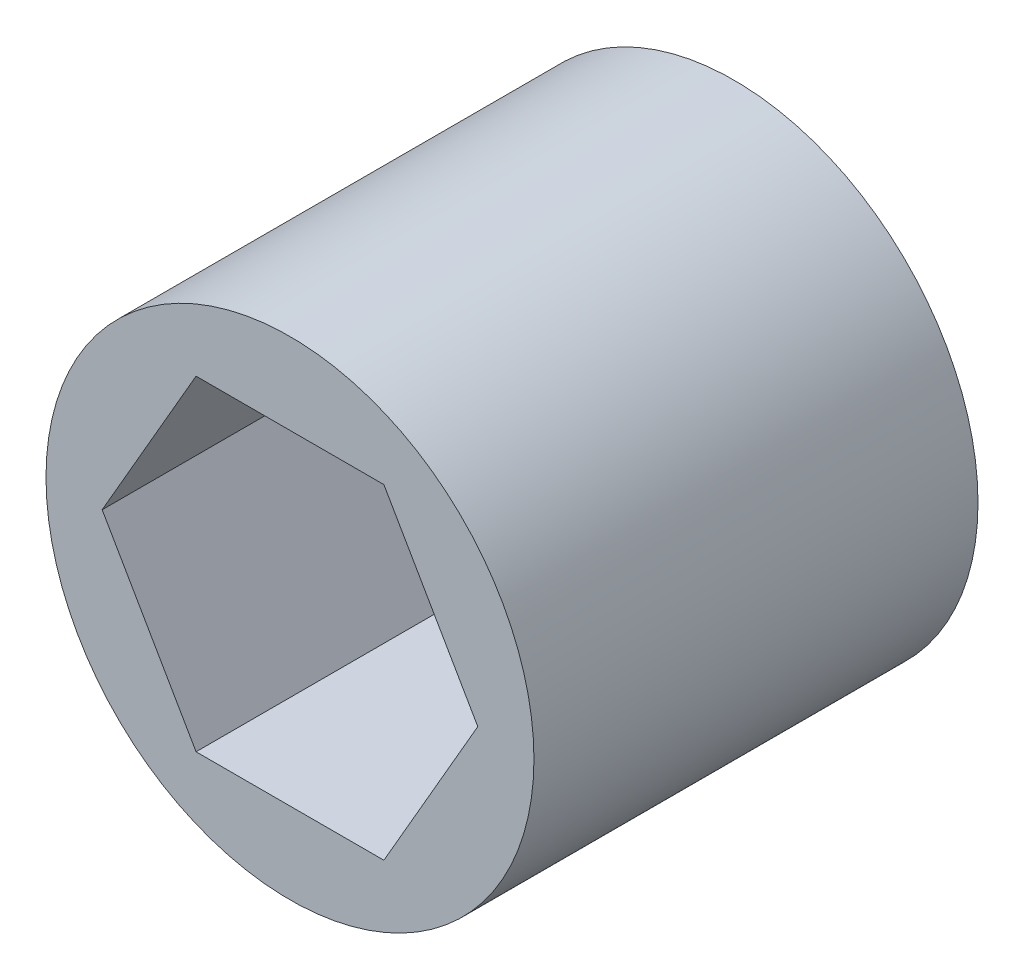
ISO-10303-21;
HEADER;
FILE_DESCRIPTION(('STEP AP214'),'2;1');
FILE_NAME('part.step','',(''),(''),'','','');
FILE_SCHEMA(('AUTOMOTIVE_DESIGN { 1 0 10303 214 1 1 1 1 }'));
ENDSEC;
DATA;
#1=APPLICATION_CONTEXT('core data for automotive mechanical design processes');
#2=APPLICATION_PROTOCOL_DEFINITION('international standard','automotive_design',2000,#1);
#3=PRODUCT_CONTEXT('',#1,'mechanical');
#4=PRODUCT('Part','Part','',(#3));
#5=PRODUCT_RELATED_PRODUCT_CATEGORY('part','',(#4));
#6=PRODUCT_DEFINITION_FORMATION('','',#4);
#7=PRODUCT_DEFINITION_CONTEXT('part definition',#1,'design');
#8=PRODUCT_DEFINITION('design','',#6,#7);
#9=PRODUCT_DEFINITION_SHAPE('','',#8);
#10=(LENGTH_UNIT() NAMED_UNIT(*) SI_UNIT(.MILLI.,.METRE.));
#11=(NAMED_UNIT(*) PLANE_ANGLE_UNIT() SI_UNIT($,.RADIAN.));
#12=(NAMED_UNIT(*) SI_UNIT($,.STERADIAN.) SOLID_ANGLE_UNIT());
#13=UNCERTAINTY_MEASURE_WITH_UNIT(LENGTH_MEASURE(1.E-05),#10,'distance_accuracy_value','');
#14=(GEOMETRIC_REPRESENTATION_CONTEXT(3) GLOBAL_UNCERTAINTY_ASSIGNED_CONTEXT((#13)) GLOBAL_UNIT_ASSIGNED_CONTEXT((#10,
#11,#12)) REPRESENTATION_CONTEXT('',''));
#15=CARTESIAN_POINT('',(0.,0.,0.));
#16=DIRECTION('',(0.,0.,1.));
#17=DIRECTION('',(1.,0.,0.));
#18=AXIS2_PLACEMENT_3D('',#15,#16,#17);
#19=CARTESIAN_POINT('',(0.,0.,17.3355));
#20=DIRECTION('',(0.,0.,1.));
#21=DIRECTION('',(1.,0.,0.));
#22=AXIS2_PLACEMENT_3D('',#19,#20,#21);
#23=PLANE('',#22);
#24=CARTESIAN_POINT('',(0.,0.,17.3355));
#25=DIRECTION('',(0.,0.,1.));
#26=DIRECTION('',(1.,0.,0.));
#27=AXIS2_PLACEMENT_3D('',#24,#25,#26);
#28=CIRCLE('',#27,9.525);
#29=CARTESIAN_POINT('',(9.525,0.,17.3355));
#30=VERTEX_POINT('',#29);
#31=EDGE_CURVE('E12',#30,#30,#28,.T.);
#32=ORIENTED_EDGE('',*,*,#31,.T.);
#33=EDGE_LOOP('',(#32));
#34=FACE_BOUND('',#33,.T.);
#35=DIRECTION('',(0.5,0.866025403784439,0.));
#36=VECTOR('',#35,1.);
#37=CARTESIAN_POINT('',(5.49926131403119,-3.175,17.3355));
#38=LINE('',#37,#36);
#39=CARTESIAN_POINT('',(3.66617420935413,-6.35,17.3355));
#40=VERTEX_POINT('',#39);
#41=CARTESIAN_POINT('',(7.33234841870825,0.,17.3355));
#42=VERTEX_POINT('',#41);
#43=EDGE_CURVE('E133',#40,#42,#38,.T.);
#44=ORIENTED_EDGE('',*,*,#43,.F.);
#45=DIRECTION('',(1.,0.,0.));
#46=VECTOR('',#45,1.);
#47=CARTESIAN_POINT('',(0.,-6.35,17.3355));
#48=LINE('',#47,#46);
#49=CARTESIAN_POINT('',(-3.66617420935412,-6.35,17.3355));
#50=VERTEX_POINT('',#49);
#51=EDGE_CURVE('E124',#50,#40,#48,.T.);
#52=ORIENTED_EDGE('',*,*,#51,.F.);
#53=DIRECTION('',(0.5,-0.866025403784439,0.));
#54=VECTOR('',#53,1.);
#55=CARTESIAN_POINT('',(-5.49926131403118,-3.175,17.3355));
#56=LINE('',#55,#54);
#57=CARTESIAN_POINT('',(-7.33234841870825,0.,17.3355));
#58=VERTEX_POINT('',#57);
#59=EDGE_CURVE('E158',#58,#50,#56,.T.);
#60=ORIENTED_EDGE('',*,*,#59,.F.);
#61=DIRECTION('',(-0.5,-0.866025403784439,0.));
#62=VECTOR('',#61,1.);
#63=CARTESIAN_POINT('',(-5.49926131403118,3.175,17.3355));
#64=LINE('',#63,#62);
#65=CARTESIAN_POINT('',(-3.66617420935412,6.35,17.3355));
#66=VERTEX_POINT('',#65);
#67=EDGE_CURVE('E155',#66,#58,#64,.T.);
#68=ORIENTED_EDGE('',*,*,#67,.F.);
#69=DIRECTION('',(-1.,0.,0.));
#70=VECTOR('',#69,1.);
#71=CARTESIAN_POINT('',(0.,6.35,17.3355));
#72=LINE('',#71,#70);
#73=CARTESIAN_POINT('',(3.66617420935412,6.35,17.3355));
#74=VERTEX_POINT('',#73);
#75=EDGE_CURVE('E150',#74,#66,#72,.T.);
#76=ORIENTED_EDGE('',*,*,#75,.F.);
#77=DIRECTION('',(-0.5,0.866025403784439,0.));
#78=VECTOR('',#77,1.);
#79=CARTESIAN_POINT('',(5.49926131403118,3.175,17.3355));
#80=LINE('',#79,#78);
#81=EDGE_CURVE('E146',#42,#74,#80,.T.);
#82=ORIENTED_EDGE('',*,*,#81,.F.);
#83=EDGE_LOOP('',(#44,#52,#60,#68,#76,#82));
#84=FACE_BOUND('',#83,.T.);
#85=ADVANCED_FACE('F70',(#34,#84),#23,.T.);
#86=CARTESIAN_POINT('',(0.,0.,0.));
#87=DIRECTION('',(0.,0.,1.));
#88=DIRECTION('',(1.,0.,0.));
#89=AXIS2_PLACEMENT_3D('',#86,#87,#88);
#90=PLANE('',#89);
#91=CARTESIAN_POINT('',(0.,0.,0.));
#92=DIRECTION('',(0.,0.,1.));
#93=DIRECTION('',(1.,0.,0.));
#94=AXIS2_PLACEMENT_3D('',#91,#92,#93);
#95=CIRCLE('',#94,9.525);
#96=CARTESIAN_POINT('',(9.525,0.,0.));
#97=VERTEX_POINT('',#96);
#98=EDGE_CURVE('E74',#97,#97,#95,.T.);
#99=ORIENTED_EDGE('',*,*,#98,.F.);
#100=EDGE_LOOP('',(#99));
#101=FACE_BOUND('',#100,.T.);
#102=DIRECTION('',(1.,0.,0.));
#103=VECTOR('',#102,1.);
#104=CARTESIAN_POINT('',(0.,-6.35,0.));
#105=LINE('',#104,#103);
#106=CARTESIAN_POINT('',(-3.66617420935412,-6.35,0.));
#107=VERTEX_POINT('',#106);
#108=CARTESIAN_POINT('',(3.66617420935413,-6.35,0.));
#109=VERTEX_POINT('',#108);
#110=EDGE_CURVE('E94',#107,#109,#105,.T.);
#111=ORIENTED_EDGE('',*,*,#110,.T.);
#112=DIRECTION('',(0.5,0.866025403784439,0.));
#113=VECTOR('',#112,1.);
#114=CARTESIAN_POINT('',(5.49926131403119,-3.175,0.));
#115=LINE('',#114,#113);
#116=CARTESIAN_POINT('',(7.33234841870825,0.,0.));
#117=VERTEX_POINT('',#116);
#118=EDGE_CURVE('E140',#109,#117,#115,.T.);
#119=ORIENTED_EDGE('',*,*,#118,.T.);
#120=DIRECTION('',(-0.5,0.866025403784439,0.));
#121=VECTOR('',#120,1.);
#122=CARTESIAN_POINT('',(5.49926131403118,3.175,0.));
#123=LINE('',#122,#121);
#124=CARTESIAN_POINT('',(3.66617420935412,6.35,0.));
#125=VERTEX_POINT('',#124);
#126=EDGE_CURVE('E165',#117,#125,#123,.T.);
#127=ORIENTED_EDGE('',*,*,#126,.T.);
#128=DIRECTION('',(-1.,0.,0.));
#129=VECTOR('',#128,1.);
#130=CARTESIAN_POINT('',(0.,6.35,0.));
#131=LINE('',#130,#129);
#132=CARTESIAN_POINT('',(-3.66617420935412,6.35,0.));
#133=VERTEX_POINT('',#132);
#134=EDGE_CURVE('E169',#125,#133,#131,.T.);
#135=ORIENTED_EDGE('',*,*,#134,.T.);
#136=DIRECTION('',(-0.5,-0.866025403784439,0.));
#137=VECTOR('',#136,1.);
#138=CARTESIAN_POINT('',(-5.49926131403118,3.175,0.));
#139=LINE('',#138,#137);
#140=CARTESIAN_POINT('',(-7.33234841870825,0.,0.));
#141=VERTEX_POINT('',#140);
#142=EDGE_CURVE('E173',#133,#141,#139,.T.);
#143=ORIENTED_EDGE('',*,*,#142,.T.);
#144=DIRECTION('',(0.5,-0.866025403784439,0.));
#145=VECTOR('',#144,1.);
#146=CARTESIAN_POINT('',(-5.49926131403118,-3.175,0.));
#147=LINE('',#146,#145);
#148=EDGE_CURVE('E134',#141,#107,#147,.T.);
#149=ORIENTED_EDGE('',*,*,#148,.T.);
#150=EDGE_LOOP('',(#111,#119,#127,#135,#143,#149));
#151=FACE_BOUND('',#150,.T.);
#152=ADVANCED_FACE('F197',(#101,#151),#90,.F.);
#153=CARTESIAN_POINT('',(0.,0.,17.3355));
#154=DIRECTION('',(0.,0.,-1.));
#155=DIRECTION('',(-1.,0.,0.));
#156=AXIS2_PLACEMENT_3D('',#153,#154,#155);
#157=CYLINDRICAL_SURFACE('',#156,9.525);
#158=ORIENTED_EDGE('',*,*,#31,.F.);
#159=EDGE_LOOP('',(#158));
#160=FACE_BOUND('',#159,.T.);
#161=ORIENTED_EDGE('',*,*,#98,.T.);
#162=EDGE_LOOP('',(#161));
#163=FACE_BOUND('',#162,.T.);
#164=ADVANCED_FACE('F72',(#160,#163),#157,.T.);
#165=CARTESIAN_POINT('',(0.,-6.35,17.3355));
#166=DIRECTION('',(0.,1.,0.));
#167=DIRECTION('',(0.,0.,1.));
#168=AXIS2_PLACEMENT_3D('',#165,#166,#167);
#169=PLANE('',#168);
#170=ORIENTED_EDGE('',*,*,#110,.F.);
#171=DIRECTION('',(0.,0.,-1.));
#172=VECTOR('',#171,1.);
#173=CARTESIAN_POINT('',(-3.66617420935412,-6.35,17.3355));
#174=LINE('',#173,#172);
#175=EDGE_CURVE('E128',#50,#107,#174,.T.);
#176=ORIENTED_EDGE('',*,*,#175,.F.);
#177=ORIENTED_EDGE('',*,*,#51,.T.);
#178=DIRECTION('',(0.,0.,-1.));
#179=VECTOR('',#178,1.);
#180=CARTESIAN_POINT('',(3.66617420935413,-6.35,17.3355));
#181=LINE('',#180,#179);
#182=EDGE_CURVE('E127',#40,#109,#181,.T.);
#183=ORIENTED_EDGE('',*,*,#182,.T.);
#184=EDGE_LOOP('',(#170,#176,#177,#183));
#185=FACE_BOUND('',#184,.T.);
#186=ADVANCED_FACE('F126',(#185),#169,.T.);
#187=CARTESIAN_POINT('',(5.49926131403119,-3.175,17.3355));
#188=DIRECTION('',(-0.866025403784439,0.5,0.));
#189=DIRECTION('',(-0.5,-0.866025403784439,0.));
#190=AXIS2_PLACEMENT_3D('',#187,#188,#189);
#191=PLANE('',#190);
#192=ORIENTED_EDGE('',*,*,#118,.F.);
#193=ORIENTED_EDGE('',*,*,#182,.F.);
#194=ORIENTED_EDGE('',*,*,#43,.T.);
#195=DIRECTION('',(0.,0.,-1.));
#196=VECTOR('',#195,1.);
#197=CARTESIAN_POINT('',(7.33234841870825,0.,17.3355));
#198=LINE('',#197,#196);
#199=EDGE_CURVE('E142',#42,#117,#198,.T.);
#200=ORIENTED_EDGE('',*,*,#199,.T.);
#201=EDGE_LOOP('',(#192,#193,#194,#200));
#202=FACE_BOUND('',#201,.T.);
#203=ADVANCED_FACE('F137',(#202),#191,.T.);
#204=CARTESIAN_POINT('',(5.49926131403118,3.175,17.3355));
#205=DIRECTION('',(-0.866025403784439,-0.5,0.));
#206=DIRECTION('',(0.5,-0.866025403784439,0.));
#207=AXIS2_PLACEMENT_3D('',#204,#205,#206);
#208=PLANE('',#207);
#209=ORIENTED_EDGE('',*,*,#126,.F.);
#210=ORIENTED_EDGE('',*,*,#199,.F.);
#211=ORIENTED_EDGE('',*,*,#81,.T.);
#212=DIRECTION('',(0.,0.,-1.));
#213=VECTOR('',#212,1.);
#214=CARTESIAN_POINT('',(3.66617420935412,6.35,17.3355));
#215=LINE('',#214,#213);
#216=EDGE_CURVE('E187',#74,#125,#215,.T.);
#217=ORIENTED_EDGE('',*,*,#216,.T.);
#218=EDGE_LOOP('',(#209,#210,#211,#217));
#219=FACE_BOUND('',#218,.T.);
#220=ADVANCED_FACE('F193',(#219),#208,.T.);
#221=CARTESIAN_POINT('',(0.,6.35,17.3355));
#222=DIRECTION('',(0.,-1.,0.));
#223=DIRECTION('',(1.,0.,0.));
#224=AXIS2_PLACEMENT_3D('',#221,#222,#223);
#225=PLANE('',#224);
#226=ORIENTED_EDGE('',*,*,#134,.F.);
#227=ORIENTED_EDGE('',*,*,#216,.F.);
#228=ORIENTED_EDGE('',*,*,#75,.T.);
#229=DIRECTION('',(0.,0.,-1.));
#230=VECTOR('',#229,1.);
#231=CARTESIAN_POINT('',(-3.66617420935412,6.35,17.3355));
#232=LINE('',#231,#230);
#233=EDGE_CURVE('E184',#66,#133,#232,.T.);
#234=ORIENTED_EDGE('',*,*,#233,.T.);
#235=EDGE_LOOP('',(#226,#227,#228,#234));
#236=FACE_BOUND('',#235,.T.);
#237=ADVANCED_FACE('F205',(#236),#225,.T.);
#238=CARTESIAN_POINT('',(-5.49926131403118,3.175,17.3355));
#239=DIRECTION('',(0.866025403784439,-0.5,0.));
#240=DIRECTION('',(0.5,0.866025403784439,0.));
#241=AXIS2_PLACEMENT_3D('',#238,#239,#240);
#242=PLANE('',#241);
#243=ORIENTED_EDGE('',*,*,#142,.F.);
#244=ORIENTED_EDGE('',*,*,#233,.F.);
#245=ORIENTED_EDGE('',*,*,#67,.T.);
#246=DIRECTION('',(0.,0.,-1.));
#247=VECTOR('',#246,1.);
#248=CARTESIAN_POINT('',(-7.33234841870825,0.,17.3355));
#249=LINE('',#248,#247);
#250=EDGE_CURVE('E86',#58,#141,#249,.T.);
#251=ORIENTED_EDGE('',*,*,#250,.T.);
#252=EDGE_LOOP('',(#243,#244,#245,#251));
#253=FACE_BOUND('',#252,.T.);
#254=ADVANCED_FACE('F203',(#253),#242,.T.);
#255=CARTESIAN_POINT('',(-5.49926131403118,-3.175,17.3355));
#256=DIRECTION('',(0.866025403784439,0.5,0.));
#257=DIRECTION('',(-0.5,0.866025403784439,0.));
#258=AXIS2_PLACEMENT_3D('',#255,#256,#257);
#259=PLANE('',#258);
#260=ORIENTED_EDGE('',*,*,#148,.F.);
#261=ORIENTED_EDGE('',*,*,#250,.F.);
#262=ORIENTED_EDGE('',*,*,#59,.T.);
#263=ORIENTED_EDGE('',*,*,#175,.T.);
#264=EDGE_LOOP('',(#260,#261,#262,#263));
#265=FACE_BOUND('',#264,.T.);
#266=ADVANCED_FACE('F199',(#265),#259,.T.);
#267=CLOSED_SHELL('',(#85,#152,#164,#186,#203,#220,#237,#254,#266));
#268=MANIFOLD_SOLID_BREP('B2',#267);
#269=ADVANCED_BREP_SHAPE_REPRESENTATION('',(#18,#268),#14);
#270=SHAPE_DEFINITION_REPRESENTATION(#9,#269);
ENDSEC;
END-ISO-10303-21;
